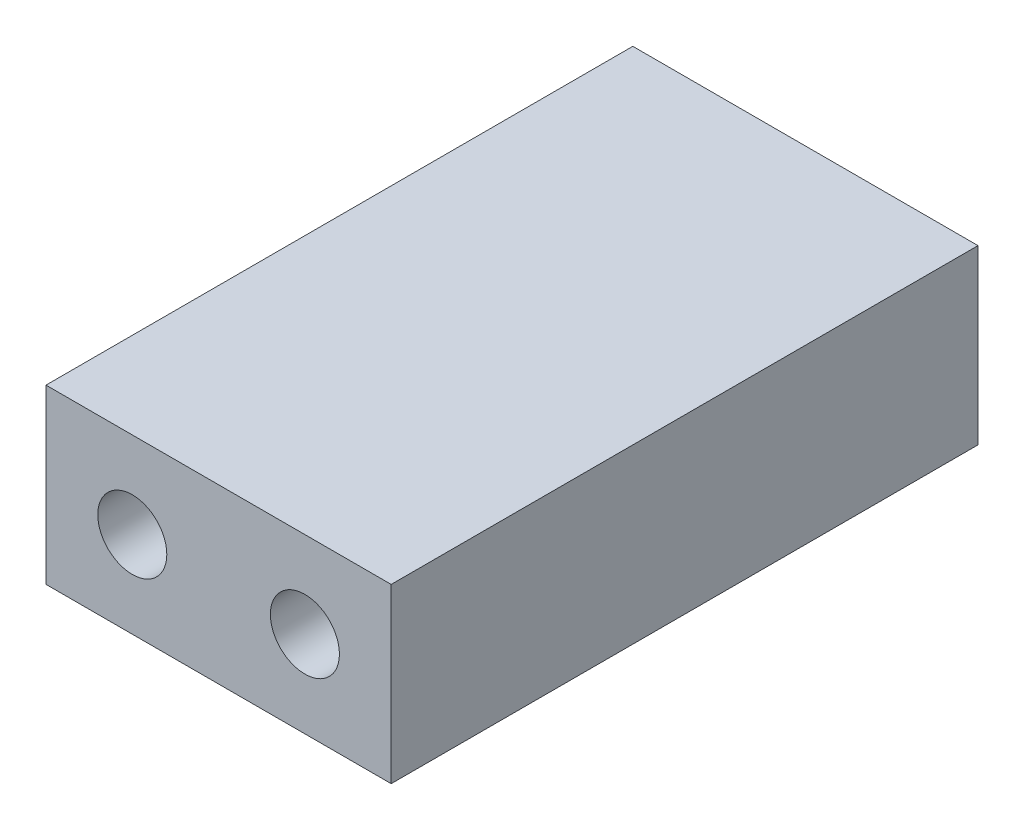
ISO-10303-21;
HEADER;
FILE_DESCRIPTION(('STEP AP214'),'2;1');
FILE_NAME('part.step','',(''),(''),'','','');
FILE_SCHEMA(('AUTOMOTIVE_DESIGN { 1 0 10303 214 1 1 1 1 }'));
ENDSEC;
DATA;
#1=APPLICATION_CONTEXT('core data for automotive mechanical design processes');
#2=APPLICATION_PROTOCOL_DEFINITION('international standard','automotive_design',2000,#1);
#3=PRODUCT_CONTEXT('',#1,'mechanical');
#4=PRODUCT('Part','Part','',(#3));
#5=PRODUCT_RELATED_PRODUCT_CATEGORY('part','',(#4));
#6=PRODUCT_DEFINITION_FORMATION('','',#4);
#7=PRODUCT_DEFINITION_CONTEXT('part definition',#1,'design');
#8=PRODUCT_DEFINITION('design','',#6,#7);
#9=PRODUCT_DEFINITION_SHAPE('','',#8);
#10=(LENGTH_UNIT() NAMED_UNIT(*) SI_UNIT(.MILLI.,.METRE.));
#11=(NAMED_UNIT(*) PLANE_ANGLE_UNIT() SI_UNIT($,.RADIAN.));
#12=(NAMED_UNIT(*) SI_UNIT($,.STERADIAN.) SOLID_ANGLE_UNIT());
#13=UNCERTAINTY_MEASURE_WITH_UNIT(LENGTH_MEASURE(1.E-05),#10,'distance_accuracy_value','');
#14=(GEOMETRIC_REPRESENTATION_CONTEXT(3) GLOBAL_UNCERTAINTY_ASSIGNED_CONTEXT((#13)) GLOBAL_UNIT_ASSIGNED_CONTEXT((#10,
#11,#12)) REPRESENTATION_CONTEXT('',''));
#15=CARTESIAN_POINT('',(0.,0.,0.));
#16=DIRECTION('',(0.,0.,1.));
#17=DIRECTION('',(1.,0.,0.));
#18=AXIS2_PLACEMENT_3D('',#15,#16,#17);
#19=CARTESIAN_POINT('',(10.,-5.,34.));
#20=DIRECTION('',(-1.,0.,0.));
#21=DIRECTION('',(0.,0.,1.));
#22=AXIS2_PLACEMENT_3D('',#19,#20,#21);
#23=PLANE('',#22);
#24=DIRECTION('',(0.,1.,0.));
#25=VECTOR('',#24,1.);
#26=CARTESIAN_POINT('',(10.,-5.,0.));
#27=LINE('',#26,#25);
#28=CARTESIAN_POINT('',(10.,-5.,0.));
#29=VERTEX_POINT('',#28);
#30=CARTESIAN_POINT('',(10.,5.,0.));
#31=VERTEX_POINT('',#30);
#32=EDGE_CURVE('E99',#29,#31,#27,.T.);
#33=ORIENTED_EDGE('',*,*,#32,.T.);
#34=DIRECTION('',(0.,0.,-1.));
#35=VECTOR('',#34,1.);
#36=CARTESIAN_POINT('',(10.,5.,34.));
#37=LINE('',#36,#35);
#38=CARTESIAN_POINT('',(10.,5.,34.));
#39=VERTEX_POINT('',#38);
#40=EDGE_CURVE('E11',#39,#31,#37,.T.);
#41=ORIENTED_EDGE('',*,*,#40,.F.);
#42=DIRECTION('',(0.,1.,0.));
#43=VECTOR('',#42,1.);
#44=CARTESIAN_POINT('',(10.,-5.,34.));
#45=LINE('',#44,#43);
#46=CARTESIAN_POINT('',(10.,-5.,34.));
#47=VERTEX_POINT('',#46);
#48=EDGE_CURVE('E87',#47,#39,#45,.T.);
#49=ORIENTED_EDGE('',*,*,#48,.F.);
#50=DIRECTION('',(0.,0.,-1.));
#51=VECTOR('',#50,1.);
#52=CARTESIAN_POINT('',(10.,-5.,34.));
#53=LINE('',#52,#51);
#54=EDGE_CURVE('E95',#47,#29,#53,.T.);
#55=ORIENTED_EDGE('',*,*,#54,.T.);
#56=EDGE_LOOP('',(#33,#41,#49,#55));
#57=FACE_BOUND('',#56,.T.);
#58=ADVANCED_FACE('F36',(#57),#23,.F.);
#59=CARTESIAN_POINT('',(-10.,5.,34.));
#60=DIRECTION('',(0.,-1.,0.));
#61=DIRECTION('',(0.,0.,-1.));
#62=AXIS2_PLACEMENT_3D('',#59,#60,#61);
#63=PLANE('',#62);
#64=DIRECTION('',(-1.,0.,0.));
#65=VECTOR('',#64,1.);
#66=CARTESIAN_POINT('',(-10.,5.,0.));
#67=LINE('',#66,#65);
#68=CARTESIAN_POINT('',(-10.,5.,0.));
#69=VERTEX_POINT('',#68);
#70=EDGE_CURVE('E91',#31,#69,#67,.T.);
#71=ORIENTED_EDGE('',*,*,#70,.T.);
#72=DIRECTION('',(0.,0.,-1.));
#73=VECTOR('',#72,1.);
#74=CARTESIAN_POINT('',(-10.,5.,34.));
#75=LINE('',#74,#73);
#76=CARTESIAN_POINT('',(-10.,5.,34.));
#77=VERTEX_POINT('',#76);
#78=EDGE_CURVE('E44',#77,#69,#75,.T.);
#79=ORIENTED_EDGE('',*,*,#78,.F.);
#80=DIRECTION('',(-1.,0.,0.));
#81=VECTOR('',#80,1.);
#82=CARTESIAN_POINT('',(-10.,5.,34.));
#83=LINE('',#82,#81);
#84=EDGE_CURVE('E82',#39,#77,#83,.T.);
#85=ORIENTED_EDGE('',*,*,#84,.F.);
#86=ORIENTED_EDGE('',*,*,#40,.T.);
#87=EDGE_LOOP('',(#71,#79,#85,#86));
#88=FACE_BOUND('',#87,.T.);
#89=ADVANCED_FACE('F90',(#88),#63,.F.);
#90=CARTESIAN_POINT('',(-10.,-5.,34.));
#91=DIRECTION('',(1.,0.,0.));
#92=DIRECTION('',(0.,0.,-1.));
#93=AXIS2_PLACEMENT_3D('',#90,#91,#92);
#94=PLANE('',#93);
#95=DIRECTION('',(0.,-1.,0.));
#96=VECTOR('',#95,1.);
#97=CARTESIAN_POINT('',(-10.,-5.,0.));
#98=LINE('',#97,#96);
#99=CARTESIAN_POINT('',(-10.,-5.,0.));
#100=VERTEX_POINT('',#99);
#101=EDGE_CURVE('E69',#69,#100,#98,.T.);
#102=ORIENTED_EDGE('',*,*,#101,.T.);
#103=DIRECTION('',(0.,0.,-1.));
#104=VECTOR('',#103,1.);
#105=CARTESIAN_POINT('',(-10.,-5.,34.));
#106=LINE('',#105,#104);
#107=CARTESIAN_POINT('',(-10.,-5.,34.));
#108=VERTEX_POINT('',#107);
#109=EDGE_CURVE('E92',#108,#100,#106,.T.);
#110=ORIENTED_EDGE('',*,*,#109,.F.);
#111=DIRECTION('',(0.,-1.,0.));
#112=VECTOR('',#111,1.);
#113=CARTESIAN_POINT('',(-10.,-5.,34.));
#114=LINE('',#113,#112);
#115=EDGE_CURVE('E85',#77,#108,#114,.T.);
#116=ORIENTED_EDGE('',*,*,#115,.F.);
#117=ORIENTED_EDGE('',*,*,#78,.T.);
#118=EDGE_LOOP('',(#102,#110,#116,#117));
#119=FACE_BOUND('',#118,.T.);
#120=ADVANCED_FACE('F93',(#119),#94,.F.);
#121=CARTESIAN_POINT('',(-10.,-5.,34.));
#122=DIRECTION('',(0.,1.,0.));
#123=DIRECTION('',(-1.,0.,0.));
#124=AXIS2_PLACEMENT_3D('',#121,#122,#123);
#125=PLANE('',#124);
#126=DIRECTION('',(1.,0.,0.));
#127=VECTOR('',#126,1.);
#128=CARTESIAN_POINT('',(-10.,-5.,0.));
#129=LINE('',#128,#127);
#130=EDGE_CURVE('E75',#100,#29,#129,.T.);
#131=ORIENTED_EDGE('',*,*,#130,.T.);
#132=ORIENTED_EDGE('',*,*,#54,.F.);
#133=DIRECTION('',(1.,0.,0.));
#134=VECTOR('',#133,1.);
#135=CARTESIAN_POINT('',(-10.,-5.,34.));
#136=LINE('',#135,#134);
#137=EDGE_CURVE('E52',#108,#47,#136,.T.);
#138=ORIENTED_EDGE('',*,*,#137,.F.);
#139=ORIENTED_EDGE('',*,*,#109,.T.);
#140=EDGE_LOOP('',(#131,#132,#138,#139));
#141=FACE_BOUND('',#140,.T.);
#142=ADVANCED_FACE('F107',(#141),#125,.F.);
#143=CARTESIAN_POINT('',(0.,0.,34.));
#144=DIRECTION('',(0.,0.,-1.));
#145=DIRECTION('',(-1.,0.,0.));
#146=AXIS2_PLACEMENT_3D('',#143,#144,#145);
#147=PLANE('',#146);
#148=CARTESIAN_POINT('',(-5.,0.,34.));
#149=DIRECTION('',(0.,0.,1.));
#150=DIRECTION('',(1.,0.,0.));
#151=AXIS2_PLACEMENT_3D('',#148,#149,#150);
#152=CIRCLE('',#151,2.);
#153=CARTESIAN_POINT('',(-3.,0.,34.));
#154=VERTEX_POINT('',#153);
#155=EDGE_CURVE('E119',#154,#154,#152,.T.);
#156=ORIENTED_EDGE('',*,*,#155,.F.);
#157=EDGE_LOOP('',(#156));
#158=FACE_BOUND('',#157,.T.);
#159=CARTESIAN_POINT('',(5.,0.,34.));
#160=DIRECTION('',(0.,0.,1.));
#161=DIRECTION('',(1.,0.,0.));
#162=AXIS2_PLACEMENT_3D('',#159,#160,#161);
#163=CIRCLE('',#162,2.);
#164=CARTESIAN_POINT('',(7.,0.,34.));
#165=VERTEX_POINT('',#164);
#166=EDGE_CURVE('E113',#165,#165,#163,.T.);
#167=ORIENTED_EDGE('',*,*,#166,.F.);
#168=EDGE_LOOP('',(#167));
#169=FACE_BOUND('',#168,.T.);
#170=ORIENTED_EDGE('',*,*,#48,.T.);
#171=ORIENTED_EDGE('',*,*,#84,.T.);
#172=ORIENTED_EDGE('',*,*,#115,.T.);
#173=ORIENTED_EDGE('',*,*,#137,.T.);
#174=EDGE_LOOP('',(#170,#171,#172,#173));
#175=FACE_BOUND('',#174,.T.);
#176=ADVANCED_FACE('F83',(#158,#169,#175),#147,.F.);
#177=CARTESIAN_POINT('',(0.,0.,0.));
#178=DIRECTION('',(0.,0.,-1.));
#179=DIRECTION('',(-1.,0.,0.));
#180=AXIS2_PLACEMENT_3D('',#177,#178,#179);
#181=PLANE('',#180);
#182=CARTESIAN_POINT('',(-5.,0.,0.));
#183=DIRECTION('',(0.,0.,1.));
#184=DIRECTION('',(1.,0.,0.));
#185=AXIS2_PLACEMENT_3D('',#182,#183,#184);
#186=CIRCLE('',#185,2.);
#187=CARTESIAN_POINT('',(-3.,0.,0.));
#188=VERTEX_POINT('',#187);
#189=EDGE_CURVE('E102',#188,#188,#186,.T.);
#190=ORIENTED_EDGE('',*,*,#189,.T.);
#191=EDGE_LOOP('',(#190));
#192=FACE_BOUND('',#191,.T.);
#193=CARTESIAN_POINT('',(5.,0.,0.));
#194=DIRECTION('',(0.,0.,1.));
#195=DIRECTION('',(1.,0.,0.));
#196=AXIS2_PLACEMENT_3D('',#193,#194,#195);
#197=CIRCLE('',#196,2.);
#198=CARTESIAN_POINT('',(7.,0.,0.));
#199=VERTEX_POINT('',#198);
#200=EDGE_CURVE('E116',#199,#199,#197,.T.);
#201=ORIENTED_EDGE('',*,*,#200,.T.);
#202=EDGE_LOOP('',(#201));
#203=FACE_BOUND('',#202,.T.);
#204=ORIENTED_EDGE('',*,*,#32,.F.);
#205=ORIENTED_EDGE('',*,*,#130,.F.);
#206=ORIENTED_EDGE('',*,*,#101,.F.);
#207=ORIENTED_EDGE('',*,*,#70,.F.);
#208=EDGE_LOOP('',(#204,#205,#206,#207));
#209=FACE_BOUND('',#208,.T.);
#210=ADVANCED_FACE('F110',(#192,#203,#209),#181,.T.);
#211=CARTESIAN_POINT('',(5.,0.,0.));
#212=DIRECTION('',(0.,0.,1.));
#213=DIRECTION('',(1.,0.,0.));
#214=AXIS2_PLACEMENT_3D('',#211,#212,#213);
#215=CYLINDRICAL_SURFACE('',#214,2.);
#216=ORIENTED_EDGE('',*,*,#200,.F.);
#217=EDGE_LOOP('',(#216));
#218=FACE_BOUND('',#217,.T.);
#219=ORIENTED_EDGE('',*,*,#166,.T.);
#220=EDGE_LOOP('',(#219));
#221=FACE_BOUND('',#220,.T.);
#222=ADVANCED_FACE('F130',(#218,#221),#215,.F.);
#223=CARTESIAN_POINT('',(-5.,0.,0.));
#224=DIRECTION('',(0.,0.,1.));
#225=DIRECTION('',(1.,0.,0.));
#226=AXIS2_PLACEMENT_3D('',#223,#224,#225);
#227=CYLINDRICAL_SURFACE('',#226,2.);
#228=ORIENTED_EDGE('',*,*,#189,.F.);
#229=EDGE_LOOP('',(#228));
#230=FACE_BOUND('',#229,.T.);
#231=ORIENTED_EDGE('',*,*,#155,.T.);
#232=EDGE_LOOP('',(#231));
#233=FACE_BOUND('',#232,.T.);
#234=ADVANCED_FACE('F127',(#230,#233),#227,.F.);
#235=CLOSED_SHELL('',(#58,#89,#120,#142,#176,#210,#222,#234));
#236=MANIFOLD_SOLID_BREP('B2',#235);
#237=ADVANCED_BREP_SHAPE_REPRESENTATION('',(#18,#236),#14);
#238=SHAPE_DEFINITION_REPRESENTATION(#9,#237);
ENDSEC;
END-ISO-10303-21;
